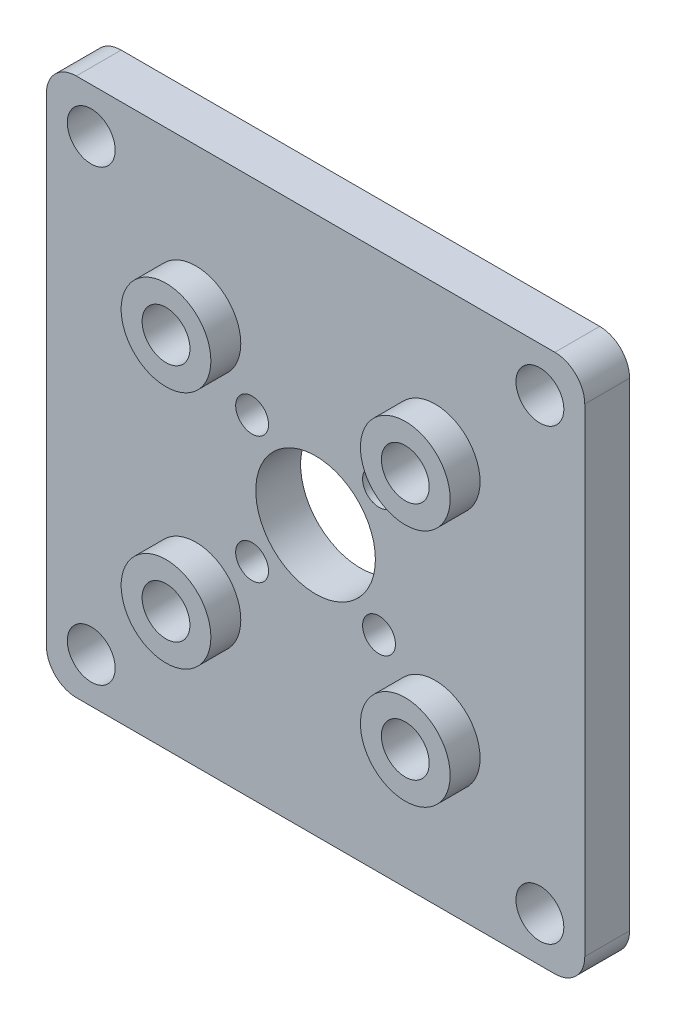
ISO-10303-21;
HEADER;
FILE_DESCRIPTION(('STEP AP214'),'2;1');
FILE_NAME('part.step','',(''),(''),'','','');
FILE_SCHEMA(('AUTOMOTIVE_DESIGN { 1 0 10303 214 1 1 1 1 }'));
ENDSEC;
DATA;
#1=APPLICATION_CONTEXT('core data for automotive mechanical design processes');
#2=APPLICATION_PROTOCOL_DEFINITION('international standard','automotive_design',2000,#1);
#3=PRODUCT_CONTEXT('',#1,'mechanical');
#4=PRODUCT('Part','Part','',(#3));
#5=PRODUCT_RELATED_PRODUCT_CATEGORY('part','',(#4));
#6=PRODUCT_DEFINITION_FORMATION('','',#4);
#7=PRODUCT_DEFINITION_CONTEXT('part definition',#1,'design');
#8=PRODUCT_DEFINITION('design','',#6,#7);
#9=PRODUCT_DEFINITION_SHAPE('','',#8);
#10=(LENGTH_UNIT() NAMED_UNIT(*) SI_UNIT(.MILLI.,.METRE.));
#11=(NAMED_UNIT(*) PLANE_ANGLE_UNIT() SI_UNIT($,.RADIAN.));
#12=(NAMED_UNIT(*) SI_UNIT($,.STERADIAN.) SOLID_ANGLE_UNIT());
#13=UNCERTAINTY_MEASURE_WITH_UNIT(LENGTH_MEASURE(1.E-05),#10,'distance_accuracy_value','');
#14=(GEOMETRIC_REPRESENTATION_CONTEXT(3) GLOBAL_UNCERTAINTY_ASSIGNED_CONTEXT((#13)) GLOBAL_UNIT_ASSIGNED_CONTEXT((#10,
#11,#12)) REPRESENTATION_CONTEXT('',''));
#15=CARTESIAN_POINT('',(0.,0.,0.));
#16=DIRECTION('',(0.,0.,1.));
#17=DIRECTION('',(1.,0.,0.));
#18=AXIS2_PLACEMENT_3D('',#15,#16,#17);
#19=CARTESIAN_POINT('',(0.,0.,3.));
#20=DIRECTION('',(0.,0.,1.));
#21=DIRECTION('',(1.,0.,0.));
#22=AXIS2_PLACEMENT_3D('',#19,#20,#21);
#23=PLANE('',#22);
#24=CARTESIAN_POINT('',(-8.,-8.,3.));
#25=DIRECTION('',(0.,0.,1.));
#26=DIRECTION('',(1.,0.,0.));
#27=AXIS2_PLACEMENT_3D('',#24,#25,#26);
#28=CIRCLE('',#27,3.);
#29=CARTESIAN_POINT('',(-5.,-8.,3.));
#30=VERTEX_POINT('',#29);
#31=EDGE_CURVE('E250',#30,#30,#28,.T.);
#32=ORIENTED_EDGE('',*,*,#31,.F.);
#33=EDGE_LOOP('',(#32));
#34=FACE_BOUND('',#33,.T.);
#35=CARTESIAN_POINT('',(8.,-8.,3.));
#36=DIRECTION('',(0.,0.,1.));
#37=DIRECTION('',(1.,0.,0.));
#38=AXIS2_PLACEMENT_3D('',#35,#36,#37);
#39=CIRCLE('',#38,3.);
#40=CARTESIAN_POINT('',(11.,-8.,3.));
#41=VERTEX_POINT('',#40);
#42=EDGE_CURVE('E244',#41,#41,#39,.T.);
#43=ORIENTED_EDGE('',*,*,#42,.F.);
#44=EDGE_LOOP('',(#43));
#45=FACE_BOUND('',#44,.T.);
#46=CARTESIAN_POINT('',(8.,8.,3.));
#47=DIRECTION('',(0.,0.,1.));
#48=DIRECTION('',(1.,0.,0.));
#49=AXIS2_PLACEMENT_3D('',#46,#47,#48);
#50=CIRCLE('',#49,3.);
#51=CARTESIAN_POINT('',(11.,8.,3.));
#52=VERTEX_POINT('',#51);
#53=EDGE_CURVE('E238',#52,#52,#50,.T.);
#54=ORIENTED_EDGE('',*,*,#53,.F.);
#55=EDGE_LOOP('',(#54));
#56=FACE_BOUND('',#55,.T.);
#57=CARTESIAN_POINT('',(-8.,8.,3.));
#58=DIRECTION('',(0.,0.,1.));
#59=DIRECTION('',(1.,0.,0.));
#60=AXIS2_PLACEMENT_3D('',#57,#58,#59);
#61=CIRCLE('',#60,3.);
#62=CARTESIAN_POINT('',(-5.,8.,3.));
#63=VERTEX_POINT('',#62);
#64=EDGE_CURVE('E232',#63,#63,#61,.T.);
#65=ORIENTED_EDGE('',*,*,#64,.F.);
#66=EDGE_LOOP('',(#65));
#67=FACE_BOUND('',#66,.T.);
#68=CARTESIAN_POINT('',(15.,-15.,3.));
#69=DIRECTION('',(0.,0.,1.));
#70=DIRECTION('',(1.,0.,0.));
#71=AXIS2_PLACEMENT_3D('',#68,#69,#70);
#72=CIRCLE('',#71,1.6);
#73=CARTESIAN_POINT('',(16.6,-15.,3.));
#74=VERTEX_POINT('',#73);
#75=EDGE_CURVE('E217',#74,#74,#72,.T.);
#76=ORIENTED_EDGE('',*,*,#75,.F.);
#77=EDGE_LOOP('',(#76));
#78=FACE_BOUND('',#77,.T.);
#79=CARTESIAN_POINT('',(-15.,15.,3.));
#80=DIRECTION('',(0.,0.,1.));
#81=DIRECTION('',(1.,0.,0.));
#82=AXIS2_PLACEMENT_3D('',#79,#80,#81);
#83=CIRCLE('',#82,1.6);
#84=CARTESIAN_POINT('',(-13.4,15.,3.));
#85=VERTEX_POINT('',#84);
#86=EDGE_CURVE('E205',#85,#85,#83,.T.);
#87=ORIENTED_EDGE('',*,*,#86,.F.);
#88=EDGE_LOOP('',(#87));
#89=FACE_BOUND('',#88,.T.);
#90=CARTESIAN_POINT('',(4.2426406871195,-4.24264068711907,3.));
#91=DIRECTION('',(0.,0.,1.));
#92=DIRECTION('',(1.,0.,0.));
#93=AXIS2_PLACEMENT_3D('',#90,#91,#92);
#94=CIRCLE('',#93,1.1);
#95=CARTESIAN_POINT('',(5.3426406871195,-4.24264068711907,3.));
#96=VERTEX_POINT('',#95);
#97=EDGE_CURVE('E193',#96,#96,#94,.T.);
#98=ORIENTED_EDGE('',*,*,#97,.F.);
#99=EDGE_LOOP('',(#98));
#100=FACE_BOUND('',#99,.T.);
#101=CARTESIAN_POINT('',(0.,0.,3.));
#102=DIRECTION('',(0.,0.,1.));
#103=DIRECTION('',(1.,0.,0.));
#104=AXIS2_PLACEMENT_3D('',#101,#102,#103);
#105=CIRCLE('',#104,4.);
#106=CARTESIAN_POINT('',(4.,0.,3.));
#107=VERTEX_POINT('',#106);
#108=EDGE_CURVE('E182',#107,#107,#105,.T.);
#109=ORIENTED_EDGE('',*,*,#108,.F.);
#110=EDGE_LOOP('',(#109));
#111=FACE_BOUND('',#110,.T.);
#112=DIRECTION('',(-1.,0.,0.));
#113=VECTOR('',#112,1.);
#114=CARTESIAN_POINT('',(18.,18.,3.));
#115=LINE('',#114,#113);
#116=CARTESIAN_POINT('',(16.,18.,3.));
#117=VERTEX_POINT('',#116);
#118=CARTESIAN_POINT('',(-16.,18.,3.));
#119=VERTEX_POINT('',#118);
#120=EDGE_CURVE('E137',#117,#119,#115,.T.);
#121=ORIENTED_EDGE('',*,*,#120,.T.);
#122=CARTESIAN_POINT('',(-16.,16.,3.));
#123=DIRECTION('',(0.,0.,1.));
#124=DIRECTION('',(1.,0.,0.));
#125=AXIS2_PLACEMENT_3D('',#122,#123,#124);
#126=CIRCLE('',#125,2.);
#127=CARTESIAN_POINT('',(-18.,16.,3.));
#128=VERTEX_POINT('',#127);
#129=EDGE_CURVE('E156',#119,#128,#126,.T.);
#130=ORIENTED_EDGE('',*,*,#129,.T.);
#131=DIRECTION('',(0.,-1.,0.));
#132=VECTOR('',#131,1.);
#133=CARTESIAN_POINT('',(-18.,-18.,3.));
#134=LINE('',#133,#132);
#135=CARTESIAN_POINT('',(-18.,-16.,3.));
#136=VERTEX_POINT('',#135);
#137=EDGE_CURVE('E120',#128,#136,#134,.T.);
#138=ORIENTED_EDGE('',*,*,#137,.T.);
#139=CARTESIAN_POINT('',(-16.,-16.,3.));
#140=DIRECTION('',(0.,0.,1.));
#141=DIRECTION('',(1.,0.,0.));
#142=AXIS2_PLACEMENT_3D('',#139,#140,#141);
#143=CIRCLE('',#142,2.);
#144=CARTESIAN_POINT('',(-16.,-18.,3.));
#145=VERTEX_POINT('',#144);
#146=EDGE_CURVE('E154',#136,#145,#143,.T.);
#147=ORIENTED_EDGE('',*,*,#146,.T.);
#148=DIRECTION('',(1.,0.,0.));
#149=VECTOR('',#148,1.);
#150=CARTESIAN_POINT('',(18.,-18.,3.));
#151=LINE('',#150,#149);
#152=CARTESIAN_POINT('',(16.,-18.,3.));
#153=VERTEX_POINT('',#152);
#154=EDGE_CURVE('E167',#145,#153,#151,.T.);
#155=ORIENTED_EDGE('',*,*,#154,.T.);
#156=CARTESIAN_POINT('',(16.,-16.,3.));
#157=DIRECTION('',(0.,0.,1.));
#158=DIRECTION('',(1.,0.,0.));
#159=AXIS2_PLACEMENT_3D('',#156,#157,#158);
#160=CIRCLE('',#159,2.);
#161=CARTESIAN_POINT('',(18.,-16.,3.));
#162=VERTEX_POINT('',#161);
#163=EDGE_CURVE('E55',#153,#162,#160,.T.);
#164=ORIENTED_EDGE('',*,*,#163,.T.);
#165=DIRECTION('',(0.,1.,0.));
#166=VECTOR('',#165,1.);
#167=CARTESIAN_POINT('',(18.,-18.,3.));
#168=LINE('',#167,#166);
#169=CARTESIAN_POINT('',(18.,16.,3.));
#170=VERTEX_POINT('',#169);
#171=EDGE_CURVE('E175',#162,#170,#168,.T.);
#172=ORIENTED_EDGE('',*,*,#171,.T.);
#173=CARTESIAN_POINT('',(16.,16.,3.));
#174=DIRECTION('',(0.,0.,1.));
#175=DIRECTION('',(1.,0.,0.));
#176=AXIS2_PLACEMENT_3D('',#173,#174,#175);
#177=CIRCLE('',#176,2.);
#178=EDGE_CURVE('E151',#170,#117,#177,.T.);
#179=ORIENTED_EDGE('',*,*,#178,.T.);
#180=EDGE_LOOP('',(#121,#130,#138,#147,#155,#164,#172,#179));
#181=FACE_BOUND('',#180,.T.);
#182=CARTESIAN_POINT('',(-4.24264068711926,4.24264068711931,3.));
#183=DIRECTION('',(0.,0.,1.));
#184=DIRECTION('',(1.,0.,0.));
#185=AXIS2_PLACEMENT_3D('',#182,#183,#184);
#186=CIRCLE('',#185,1.1);
#187=CARTESIAN_POINT('',(-3.14264068711926,4.24264068711931,3.));
#188=VERTEX_POINT('',#187);
#189=EDGE_CURVE('E128',#188,#188,#186,.T.);
#190=ORIENTED_EDGE('',*,*,#189,.F.);
#191=EDGE_LOOP('',(#190));
#192=FACE_BOUND('',#191,.T.);
#193=CARTESIAN_POINT('',(4.24264068711931,4.2426406871195,3.));
#194=DIRECTION('',(0.,0.,1.));
#195=DIRECTION('',(1.,0.,0.));
#196=AXIS2_PLACEMENT_3D('',#193,#194,#195);
#197=CIRCLE('',#196,1.1);
#198=CARTESIAN_POINT('',(5.34264068711931,4.2426406871195,3.));
#199=VERTEX_POINT('',#198);
#200=EDGE_CURVE('E187',#199,#199,#197,.T.);
#201=ORIENTED_EDGE('',*,*,#200,.F.);
#202=EDGE_LOOP('',(#201));
#203=FACE_BOUND('',#202,.T.);
#204=CARTESIAN_POINT('',(-4.24264068711907,-4.24264068711926,3.));
#205=DIRECTION('',(0.,0.,1.));
#206=DIRECTION('',(1.,0.,0.));
#207=AXIS2_PLACEMENT_3D('',#204,#205,#206);
#208=CIRCLE('',#207,1.1);
#209=CARTESIAN_POINT('',(-3.14264068711907,-4.24264068711926,3.));
#210=VERTEX_POINT('',#209);
#211=EDGE_CURVE('E199',#210,#210,#208,.T.);
#212=ORIENTED_EDGE('',*,*,#211,.F.);
#213=EDGE_LOOP('',(#212));
#214=FACE_BOUND('',#213,.T.);
#215=CARTESIAN_POINT('',(15.,15.,3.));
#216=DIRECTION('',(0.,0.,1.));
#217=DIRECTION('',(-1.,0.,0.));
#218=AXIS2_PLACEMENT_3D('',#215,#216,#217);
#219=CIRCLE('',#218,1.6);
#220=CARTESIAN_POINT('',(13.4,15.,3.));
#221=VERTEX_POINT('',#220);
#222=EDGE_CURVE('E211',#221,#221,#219,.T.);
#223=ORIENTED_EDGE('',*,*,#222,.F.);
#224=EDGE_LOOP('',(#223));
#225=FACE_BOUND('',#224,.T.);
#226=CARTESIAN_POINT('',(-15.,-15.,3.));
#227=DIRECTION('',(0.,0.,1.));
#228=DIRECTION('',(-1.,0.,0.));
#229=AXIS2_PLACEMENT_3D('',#226,#227,#228);
#230=CIRCLE('',#229,1.6);
#231=CARTESIAN_POINT('',(-16.6,-15.,3.));
#232=VERTEX_POINT('',#231);
#233=EDGE_CURVE('E223',#232,#232,#230,.T.);
#234=ORIENTED_EDGE('',*,*,#233,.F.);
#235=EDGE_LOOP('',(#234));
#236=FACE_BOUND('',#235,.T.);
#237=ADVANCED_FACE('F34',(#34,#45,#56,#67,#78,#89,#100,#111,#181,#192,#203,#214,#225,#236),#23,.T.);
#238=CARTESIAN_POINT('',(0.,0.,0.));
#239=DIRECTION('',(0.,0.,1.));
#240=DIRECTION('',(1.,0.,0.));
#241=AXIS2_PLACEMENT_3D('',#238,#239,#240);
#242=PLANE('',#241);
#243=CARTESIAN_POINT('',(8.,8.,0.));
#244=DIRECTION('',(0.,0.,1.));
#245=DIRECTION('',(-1.,0.,0.));
#246=AXIS2_PLACEMENT_3D('',#243,#244,#245);
#247=CIRCLE('',#246,1.6);
#248=CARTESIAN_POINT('',(6.4,8.,0.));
#249=VERTEX_POINT('',#248);
#250=EDGE_CURVE('E259',#249,#249,#247,.T.);
#251=ORIENTED_EDGE('',*,*,#250,.T.);
#252=EDGE_LOOP('',(#251));
#253=FACE_BOUND('',#252,.T.);
#254=CARTESIAN_POINT('',(8.,-8.,0.));
#255=DIRECTION('',(0.,0.,1.));
#256=DIRECTION('',(1.,0.,0.));
#257=AXIS2_PLACEMENT_3D('',#254,#255,#256);
#258=CIRCLE('',#257,1.6);
#259=CARTESIAN_POINT('',(9.6,-8.,0.));
#260=VERTEX_POINT('',#259);
#261=EDGE_CURVE('E271',#260,#260,#258,.T.);
#262=ORIENTED_EDGE('',*,*,#261,.T.);
#263=EDGE_LOOP('',(#262));
#264=FACE_BOUND('',#263,.T.);
#265=CARTESIAN_POINT('',(-8.,-8.,0.));
#266=DIRECTION('',(0.,0.,1.));
#267=DIRECTION('',(-1.,0.,0.));
#268=AXIS2_PLACEMENT_3D('',#265,#266,#267);
#269=CIRCLE('',#268,1.6);
#270=CARTESIAN_POINT('',(-9.6,-8.,0.));
#271=VERTEX_POINT('',#270);
#272=EDGE_CURVE('E265',#271,#271,#269,.T.);
#273=ORIENTED_EDGE('',*,*,#272,.T.);
#274=EDGE_LOOP('',(#273));
#275=FACE_BOUND('',#274,.T.);
#276=CARTESIAN_POINT('',(-8.,8.,0.));
#277=DIRECTION('',(0.,0.,1.));
#278=DIRECTION('',(1.,0.,0.));
#279=AXIS2_PLACEMENT_3D('',#276,#277,#278);
#280=CIRCLE('',#279,1.6);
#281=CARTESIAN_POINT('',(-6.4,8.,0.));
#282=VERTEX_POINT('',#281);
#283=EDGE_CURVE('E253',#282,#282,#280,.T.);
#284=ORIENTED_EDGE('',*,*,#283,.T.);
#285=EDGE_LOOP('',(#284));
#286=FACE_BOUND('',#285,.T.);
#287=DIRECTION('',(0.,-1.,0.));
#288=VECTOR('',#287,1.);
#289=CARTESIAN_POINT('',(-18.,-18.,0.));
#290=LINE('',#289,#288);
#291=CARTESIAN_POINT('',(-18.,16.,0.));
#292=VERTEX_POINT('',#291);
#293=CARTESIAN_POINT('',(-18.,-16.,0.));
#294=VERTEX_POINT('',#293);
#295=EDGE_CURVE('E117',#292,#294,#290,.T.);
#296=ORIENTED_EDGE('',*,*,#295,.F.);
#297=CARTESIAN_POINT('',(-16.,16.,0.));
#298=DIRECTION('',(0.,0.,1.));
#299=DIRECTION('',(1.,0.,0.));
#300=AXIS2_PLACEMENT_3D('',#297,#298,#299);
#301=CIRCLE('',#300,2.);
#302=CARTESIAN_POINT('',(-16.,18.,0.));
#303=VERTEX_POINT('',#302);
#304=EDGE_CURVE('E100',#292,#303,#301,.F.);
#305=ORIENTED_EDGE('',*,*,#304,.T.);
#306=DIRECTION('',(-1.,0.,0.));
#307=VECTOR('',#306,1.);
#308=CARTESIAN_POINT('',(18.,18.,0.));
#309=LINE('',#308,#307);
#310=CARTESIAN_POINT('',(16.,18.,0.));
#311=VERTEX_POINT('',#310);
#312=EDGE_CURVE('E141',#311,#303,#309,.T.);
#313=ORIENTED_EDGE('',*,*,#312,.F.);
#314=CARTESIAN_POINT('',(16.,16.,0.));
#315=DIRECTION('',(0.,0.,1.));
#316=DIRECTION('',(1.,0.,0.));
#317=AXIS2_PLACEMENT_3D('',#314,#315,#316);
#318=CIRCLE('',#317,2.);
#319=CARTESIAN_POINT('',(18.,16.,0.));
#320=VERTEX_POINT('',#319);
#321=EDGE_CURVE('E121',#311,#320,#318,.F.);
#322=ORIENTED_EDGE('',*,*,#321,.T.);
#323=DIRECTION('',(0.,1.,0.));
#324=VECTOR('',#323,1.);
#325=CARTESIAN_POINT('',(18.,-18.,0.));
#326=LINE('',#325,#324);
#327=CARTESIAN_POINT('',(18.,-16.,0.));
#328=VERTEX_POINT('',#327);
#329=EDGE_CURVE('E131',#328,#320,#326,.T.);
#330=ORIENTED_EDGE('',*,*,#329,.F.);
#331=CARTESIAN_POINT('',(16.,-16.,0.));
#332=DIRECTION('',(0.,0.,1.));
#333=DIRECTION('',(1.,0.,0.));
#334=AXIS2_PLACEMENT_3D('',#331,#332,#333);
#335=CIRCLE('',#334,2.);
#336=CARTESIAN_POINT('',(16.,-18.,0.));
#337=VERTEX_POINT('',#336);
#338=EDGE_CURVE('E145',#328,#337,#335,.F.);
#339=ORIENTED_EDGE('',*,*,#338,.T.);
#340=DIRECTION('',(1.,0.,0.));
#341=VECTOR('',#340,1.);
#342=CARTESIAN_POINT('',(18.,-18.,0.));
#343=LINE('',#342,#341);
#344=CARTESIAN_POINT('',(-16.,-18.,0.));
#345=VERTEX_POINT('',#344);
#346=EDGE_CURVE('E127',#345,#337,#343,.T.);
#347=ORIENTED_EDGE('',*,*,#346,.F.);
#348=CARTESIAN_POINT('',(-16.,-16.,0.));
#349=DIRECTION('',(0.,0.,1.));
#350=DIRECTION('',(1.,0.,0.));
#351=AXIS2_PLACEMENT_3D('',#348,#349,#350);
#352=CIRCLE('',#351,2.);
#353=EDGE_CURVE('E111',#345,#294,#352,.F.);
#354=ORIENTED_EDGE('',*,*,#353,.T.);
#355=EDGE_LOOP('',(#296,#305,#313,#322,#330,#339,#347,#354));
#356=FACE_BOUND('',#355,.T.);
#357=CARTESIAN_POINT('',(-4.24264068711926,4.24264068711931,0.));
#358=DIRECTION('',(0.,0.,1.));
#359=DIRECTION('',(1.,0.,0.));
#360=AXIS2_PLACEMENT_3D('',#357,#358,#359);
#361=CIRCLE('',#360,1.1);
#362=CARTESIAN_POINT('',(-3.14264068711926,4.24264068711931,0.));
#363=VERTEX_POINT('',#362);
#364=EDGE_CURVE('E134',#363,#363,#361,.T.);
#365=ORIENTED_EDGE('',*,*,#364,.T.);
#366=EDGE_LOOP('',(#365));
#367=FACE_BOUND('',#366,.T.);
#368=CARTESIAN_POINT('',(0.,0.,0.));
#369=DIRECTION('',(0.,0.,1.));
#370=DIRECTION('',(1.,0.,0.));
#371=AXIS2_PLACEMENT_3D('',#368,#369,#370);
#372=CIRCLE('',#371,4.);
#373=CARTESIAN_POINT('',(4.,0.,0.));
#374=VERTEX_POINT('',#373);
#375=EDGE_CURVE('E184',#374,#374,#372,.T.);
#376=ORIENTED_EDGE('',*,*,#375,.T.);
#377=EDGE_LOOP('',(#376));
#378=FACE_BOUND('',#377,.T.);
#379=CARTESIAN_POINT('',(4.24264068711931,4.2426406871195,0.));
#380=DIRECTION('',(0.,0.,1.));
#381=DIRECTION('',(1.,0.,0.));
#382=AXIS2_PLACEMENT_3D('',#379,#380,#381);
#383=CIRCLE('',#382,1.1);
#384=CARTESIAN_POINT('',(5.34264068711931,4.2426406871195,0.));
#385=VERTEX_POINT('',#384);
#386=EDGE_CURVE('E190',#385,#385,#383,.T.);
#387=ORIENTED_EDGE('',*,*,#386,.T.);
#388=EDGE_LOOP('',(#387));
#389=FACE_BOUND('',#388,.T.);
#390=CARTESIAN_POINT('',(4.2426406871195,-4.24264068711907,0.));
#391=DIRECTION('',(0.,0.,1.));
#392=DIRECTION('',(1.,0.,0.));
#393=AXIS2_PLACEMENT_3D('',#390,#391,#392);
#394=CIRCLE('',#393,1.1);
#395=CARTESIAN_POINT('',(5.3426406871195,-4.24264068711907,0.));
#396=VERTEX_POINT('',#395);
#397=EDGE_CURVE('E196',#396,#396,#394,.T.);
#398=ORIENTED_EDGE('',*,*,#397,.T.);
#399=EDGE_LOOP('',(#398));
#400=FACE_BOUND('',#399,.T.);
#401=CARTESIAN_POINT('',(-4.24264068711907,-4.24264068711926,0.));
#402=DIRECTION('',(0.,0.,1.));
#403=DIRECTION('',(1.,0.,0.));
#404=AXIS2_PLACEMENT_3D('',#401,#402,#403);
#405=CIRCLE('',#404,1.1);
#406=CARTESIAN_POINT('',(-3.14264068711907,-4.24264068711926,0.));
#407=VERTEX_POINT('',#406);
#408=EDGE_CURVE('E202',#407,#407,#405,.T.);
#409=ORIENTED_EDGE('',*,*,#408,.T.);
#410=EDGE_LOOP('',(#409));
#411=FACE_BOUND('',#410,.T.);
#412=CARTESIAN_POINT('',(-15.,15.,0.));
#413=DIRECTION('',(0.,0.,1.));
#414=DIRECTION('',(1.,0.,0.));
#415=AXIS2_PLACEMENT_3D('',#412,#413,#414);
#416=CIRCLE('',#415,1.6);
#417=CARTESIAN_POINT('',(-13.4,15.,0.));
#418=VERTEX_POINT('',#417);
#419=EDGE_CURVE('E208',#418,#418,#416,.T.);
#420=ORIENTED_EDGE('',*,*,#419,.T.);
#421=EDGE_LOOP('',(#420));
#422=FACE_BOUND('',#421,.T.);
#423=CARTESIAN_POINT('',(15.,15.,0.));
#424=DIRECTION('',(0.,0.,1.));
#425=DIRECTION('',(-1.,0.,0.));
#426=AXIS2_PLACEMENT_3D('',#423,#424,#425);
#427=CIRCLE('',#426,1.6);
#428=CARTESIAN_POINT('',(13.4,15.,0.));
#429=VERTEX_POINT('',#428);
#430=EDGE_CURVE('E214',#429,#429,#427,.T.);
#431=ORIENTED_EDGE('',*,*,#430,.T.);
#432=EDGE_LOOP('',(#431));
#433=FACE_BOUND('',#432,.T.);
#434=CARTESIAN_POINT('',(15.,-15.,0.));
#435=DIRECTION('',(0.,0.,1.));
#436=DIRECTION('',(1.,0.,0.));
#437=AXIS2_PLACEMENT_3D('',#434,#435,#436);
#438=CIRCLE('',#437,1.6);
#439=CARTESIAN_POINT('',(16.6,-15.,0.));
#440=VERTEX_POINT('',#439);
#441=EDGE_CURVE('E220',#440,#440,#438,.T.);
#442=ORIENTED_EDGE('',*,*,#441,.T.);
#443=EDGE_LOOP('',(#442));
#444=FACE_BOUND('',#443,.T.);
#445=CARTESIAN_POINT('',(-15.,-15.,0.));
#446=DIRECTION('',(0.,0.,1.));
#447=DIRECTION('',(-1.,0.,0.));
#448=AXIS2_PLACEMENT_3D('',#445,#446,#447);
#449=CIRCLE('',#448,1.6);
#450=CARTESIAN_POINT('',(-16.6,-15.,0.));
#451=VERTEX_POINT('',#450);
#452=EDGE_CURVE('E226',#451,#451,#449,.T.);
#453=ORIENTED_EDGE('',*,*,#452,.T.);
#454=EDGE_LOOP('',(#453));
#455=FACE_BOUND('',#454,.T.);
#456=ADVANCED_FACE('F124',(#253,#264,#275,#286,#356,#367,#378,#389,#400,#411,#422,#433,#444,
#455),#242,.F.);
#457=CARTESIAN_POINT('',(-18.,-18.,3.));
#458=DIRECTION('',(1.,0.,0.));
#459=DIRECTION('',(0.,0.,-1.));
#460=AXIS2_PLACEMENT_3D('',#457,#458,#459);
#461=PLANE('',#460);
#462=ORIENTED_EDGE('',*,*,#137,.F.);
#463=DIRECTION('',(0.,0.,-1.));
#464=VECTOR('',#463,1.);
#465=CARTESIAN_POINT('',(-18.,16.,3.));
#466=LINE('',#465,#464);
#467=EDGE_CURVE('E104',#128,#292,#466,.T.);
#468=ORIENTED_EDGE('',*,*,#467,.T.);
#469=ORIENTED_EDGE('',*,*,#295,.T.);
#470=DIRECTION('',(0.,0.,-1.));
#471=VECTOR('',#470,1.);
#472=CARTESIAN_POINT('',(-18.,-16.,3.));
#473=LINE('',#472,#471);
#474=EDGE_CURVE('E122',#294,#136,#473,.F.);
#475=ORIENTED_EDGE('',*,*,#474,.T.);
#476=EDGE_LOOP('',(#462,#468,#469,#475));
#477=FACE_BOUND('',#476,.T.);
#478=ADVANCED_FACE('F116',(#477),#461,.F.);
#479=CARTESIAN_POINT('',(18.,-18.,3.));
#480=DIRECTION('',(0.,1.,0.));
#481=DIRECTION('',(-1.,0.,0.));
#482=AXIS2_PLACEMENT_3D('',#479,#480,#481);
#483=PLANE('',#482);
#484=ORIENTED_EDGE('',*,*,#154,.F.);
#485=DIRECTION('',(0.,0.,-1.));
#486=VECTOR('',#485,1.);
#487=CARTESIAN_POINT('',(-16.,-18.,3.));
#488=LINE('',#487,#486);
#489=EDGE_CURVE('E160',#145,#345,#488,.T.);
#490=ORIENTED_EDGE('',*,*,#489,.T.);
#491=ORIENTED_EDGE('',*,*,#346,.T.);
#492=DIRECTION('',(0.,0.,-1.));
#493=VECTOR('',#492,1.);
#494=CARTESIAN_POINT('',(16.,-18.,3.));
#495=LINE('',#494,#493);
#496=EDGE_CURVE('E158',#337,#153,#495,.F.);
#497=ORIENTED_EDGE('',*,*,#496,.T.);
#498=EDGE_LOOP('',(#484,#490,#491,#497));
#499=FACE_BOUND('',#498,.T.);
#500=ADVANCED_FACE('F165',(#499),#483,.F.);
#501=CARTESIAN_POINT('',(18.,-18.,3.));
#502=DIRECTION('',(-1.,0.,0.));
#503=DIRECTION('',(0.,0.,1.));
#504=AXIS2_PLACEMENT_3D('',#501,#502,#503);
#505=PLANE('',#504);
#506=ORIENTED_EDGE('',*,*,#171,.F.);
#507=DIRECTION('',(0.,0.,-1.));
#508=VECTOR('',#507,1.);
#509=CARTESIAN_POINT('',(18.,-16.,3.));
#510=LINE('',#509,#508);
#511=EDGE_CURVE('E11',#162,#328,#510,.T.);
#512=ORIENTED_EDGE('',*,*,#511,.T.);
#513=ORIENTED_EDGE('',*,*,#329,.T.);
#514=DIRECTION('',(0.,0.,-1.));
#515=VECTOR('',#514,1.);
#516=CARTESIAN_POINT('',(18.,16.,3.));
#517=LINE('',#516,#515);
#518=EDGE_CURVE('E42',#320,#170,#517,.F.);
#519=ORIENTED_EDGE('',*,*,#518,.T.);
#520=EDGE_LOOP('',(#506,#512,#513,#519));
#521=FACE_BOUND('',#520,.T.);
#522=ADVANCED_FACE('F174',(#521),#505,.F.);
#523=CARTESIAN_POINT('',(18.,18.,3.));
#524=DIRECTION('',(0.,-1.,0.));
#525=DIRECTION('',(1.,0.,0.));
#526=AXIS2_PLACEMENT_3D('',#523,#524,#525);
#527=PLANE('',#526);
#528=ORIENTED_EDGE('',*,*,#312,.T.);
#529=DIRECTION('',(0.,0.,-1.));
#530=VECTOR('',#529,1.);
#531=CARTESIAN_POINT('',(-16.,18.,3.));
#532=LINE('',#531,#530);
#533=EDGE_CURVE('E105',#303,#119,#532,.F.);
#534=ORIENTED_EDGE('',*,*,#533,.T.);
#535=ORIENTED_EDGE('',*,*,#120,.F.);
#536=DIRECTION('',(0.,0.,-1.));
#537=VECTOR('',#536,1.);
#538=CARTESIAN_POINT('',(16.,18.,3.));
#539=LINE('',#538,#537);
#540=EDGE_CURVE('E110',#117,#311,#539,.T.);
#541=ORIENTED_EDGE('',*,*,#540,.T.);
#542=EDGE_LOOP('',(#528,#534,#535,#541));
#543=FACE_BOUND('',#542,.T.);
#544=ADVANCED_FACE('F344',(#543),#527,.F.);
#545=CARTESIAN_POINT('',(-4.24264068711926,4.24264068711931,3.));
#546=DIRECTION('',(0.,0.,-1.));
#547=DIRECTION('',(-1.,0.,0.));
#548=AXIS2_PLACEMENT_3D('',#545,#546,#547);
#549=CYLINDRICAL_SURFACE('',#548,1.1);
#550=ORIENTED_EDGE('',*,*,#189,.T.);
#551=EDGE_LOOP('',(#550));
#552=FACE_BOUND('',#551,.T.);
#553=ORIENTED_EDGE('',*,*,#364,.F.);
#554=EDGE_LOOP('',(#553));
#555=FACE_BOUND('',#554,.T.);
#556=ADVANCED_FACE('F347',(#552,#555),#549,.F.);
#557=CARTESIAN_POINT('',(0.,0.,3.));
#558=DIRECTION('',(0.,0.,-1.));
#559=DIRECTION('',(-1.,0.,0.));
#560=AXIS2_PLACEMENT_3D('',#557,#558,#559);
#561=CYLINDRICAL_SURFACE('',#560,4.);
#562=ORIENTED_EDGE('',*,*,#108,.T.);
#563=EDGE_LOOP('',(#562));
#564=FACE_BOUND('',#563,.T.);
#565=ORIENTED_EDGE('',*,*,#375,.F.);
#566=EDGE_LOOP('',(#565));
#567=FACE_BOUND('',#566,.T.);
#568=ADVANCED_FACE('F586',(#564,#567),#561,.F.);
#569=CARTESIAN_POINT('',(4.24264068711931,4.2426406871195,3.));
#570=DIRECTION('',(0.,0.,-1.));
#571=DIRECTION('',(-1.,0.,0.));
#572=AXIS2_PLACEMENT_3D('',#569,#570,#571);
#573=CYLINDRICAL_SURFACE('',#572,1.1);
#574=ORIENTED_EDGE('',*,*,#200,.T.);
#575=EDGE_LOOP('',(#574));
#576=FACE_BOUND('',#575,.T.);
#577=ORIENTED_EDGE('',*,*,#386,.F.);
#578=EDGE_LOOP('',(#577));
#579=FACE_BOUND('',#578,.T.);
#580=ADVANCED_FACE('F576',(#576,#579),#573,.F.);
#581=CARTESIAN_POINT('',(4.2426406871195,-4.24264068711907,3.));
#582=DIRECTION('',(0.,0.,-1.));
#583=DIRECTION('',(-1.,0.,0.));
#584=AXIS2_PLACEMENT_3D('',#581,#582,#583);
#585=CYLINDRICAL_SURFACE('',#584,1.1);
#586=ORIENTED_EDGE('',*,*,#97,.T.);
#587=EDGE_LOOP('',(#586));
#588=FACE_BOUND('',#587,.T.);
#589=ORIENTED_EDGE('',*,*,#397,.F.);
#590=EDGE_LOOP('',(#589));
#591=FACE_BOUND('',#590,.T.);
#592=ADVANCED_FACE('F566',(#588,#591),#585,.F.);
#593=CARTESIAN_POINT('',(-4.24264068711907,-4.24264068711926,3.));
#594=DIRECTION('',(0.,0.,-1.));
#595=DIRECTION('',(-1.,0.,0.));
#596=AXIS2_PLACEMENT_3D('',#593,#594,#595);
#597=CYLINDRICAL_SURFACE('',#596,1.1);
#598=ORIENTED_EDGE('',*,*,#211,.T.);
#599=EDGE_LOOP('',(#598));
#600=FACE_BOUND('',#599,.T.);
#601=ORIENTED_EDGE('',*,*,#408,.F.);
#602=EDGE_LOOP('',(#601));
#603=FACE_BOUND('',#602,.T.);
#604=ADVANCED_FACE('F556',(#600,#603),#597,.F.);
#605=CARTESIAN_POINT('',(-15.,15.,3.));
#606=DIRECTION('',(0.,0.,-1.));
#607=DIRECTION('',(-1.,0.,0.));
#608=AXIS2_PLACEMENT_3D('',#605,#606,#607);
#609=CYLINDRICAL_SURFACE('',#608,1.6);
#610=ORIENTED_EDGE('',*,*,#86,.T.);
#611=EDGE_LOOP('',(#610));
#612=FACE_BOUND('',#611,.T.);
#613=ORIENTED_EDGE('',*,*,#419,.F.);
#614=EDGE_LOOP('',(#613));
#615=FACE_BOUND('',#614,.T.);
#616=ADVANCED_FACE('F546',(#612,#615),#609,.F.);
#617=CARTESIAN_POINT('',(15.,15.,3.));
#618=DIRECTION('',(0.,0.,-1.));
#619=DIRECTION('',(-1.,0.,0.));
#620=AXIS2_PLACEMENT_3D('',#617,#618,#619);
#621=CYLINDRICAL_SURFACE('',#620,1.6);
#622=ORIENTED_EDGE('',*,*,#222,.T.);
#623=EDGE_LOOP('',(#622));
#624=FACE_BOUND('',#623,.T.);
#625=ORIENTED_EDGE('',*,*,#430,.F.);
#626=EDGE_LOOP('',(#625));
#627=FACE_BOUND('',#626,.T.);
#628=ADVANCED_FACE('F536',(#624,#627),#621,.F.);
#629=CARTESIAN_POINT('',(15.,-15.,3.));
#630=DIRECTION('',(0.,0.,-1.));
#631=DIRECTION('',(-1.,0.,0.));
#632=AXIS2_PLACEMENT_3D('',#629,#630,#631);
#633=CYLINDRICAL_SURFACE('',#632,1.6);
#634=ORIENTED_EDGE('',*,*,#75,.T.);
#635=EDGE_LOOP('',(#634));
#636=FACE_BOUND('',#635,.T.);
#637=ORIENTED_EDGE('',*,*,#441,.F.);
#638=EDGE_LOOP('',(#637));
#639=FACE_BOUND('',#638,.T.);
#640=ADVANCED_FACE('F332',(#636,#639),#633,.F.);
#641=CARTESIAN_POINT('',(-15.,-15.,3.));
#642=DIRECTION('',(0.,0.,-1.));
#643=DIRECTION('',(-1.,0.,0.));
#644=AXIS2_PLACEMENT_3D('',#641,#642,#643);
#645=CYLINDRICAL_SURFACE('',#644,1.6);
#646=ORIENTED_EDGE('',*,*,#233,.T.);
#647=EDGE_LOOP('',(#646));
#648=FACE_BOUND('',#647,.T.);
#649=ORIENTED_EDGE('',*,*,#452,.F.);
#650=EDGE_LOOP('',(#649));
#651=FACE_BOUND('',#650,.T.);
#652=ADVANCED_FACE('F328',(#648,#651),#645,.F.);
#653=CARTESIAN_POINT('',(-8.,8.,5.));
#654=DIRECTION('',(0.,0.,-1.));
#655=DIRECTION('',(-1.,0.,0.));
#656=AXIS2_PLACEMENT_3D('',#653,#654,#655);
#657=CYLINDRICAL_SURFACE('',#656,3.);
#658=CARTESIAN_POINT('',(-8.,8.,5.));
#659=DIRECTION('',(0.,0.,1.));
#660=DIRECTION('',(1.,0.,0.));
#661=AXIS2_PLACEMENT_3D('',#658,#659,#660);
#662=CIRCLE('',#661,3.);
#663=CARTESIAN_POINT('',(-5.,8.,5.));
#664=VERTEX_POINT('',#663);
#665=EDGE_CURVE('E229',#664,#664,#662,.T.);
#666=ORIENTED_EDGE('',*,*,#665,.F.);
#667=EDGE_LOOP('',(#666));
#668=FACE_BOUND('',#667,.T.);
#669=ORIENTED_EDGE('',*,*,#64,.T.);
#670=EDGE_LOOP('',(#669));
#671=FACE_BOUND('',#670,.T.);
#672=ADVANCED_FACE('F331',(#668,#671),#657,.T.);
#673=CARTESIAN_POINT('',(-8.,8.,5.));
#674=DIRECTION('',(0.,0.,1.));
#675=DIRECTION('',(1.,0.,0.));
#676=AXIS2_PLACEMENT_3D('',#673,#674,#675);
#677=PLANE('',#676);
#678=CARTESIAN_POINT('',(-8.,8.,5.));
#679=DIRECTION('',(0.,0.,1.));
#680=DIRECTION('',(1.,0.,0.));
#681=AXIS2_PLACEMENT_3D('',#678,#679,#680);
#682=CIRCLE('',#681,1.6);
#683=CARTESIAN_POINT('',(-6.4,8.,5.));
#684=VERTEX_POINT('',#683);
#685=EDGE_CURVE('E256',#684,#684,#682,.T.);
#686=ORIENTED_EDGE('',*,*,#685,.F.);
#687=EDGE_LOOP('',(#686));
#688=FACE_BOUND('',#687,.T.);
#689=ORIENTED_EDGE('',*,*,#665,.T.);
#690=EDGE_LOOP('',(#689));
#691=FACE_BOUND('',#690,.T.);
#692=ADVANCED_FACE('F299',(#688,#691),#677,.T.);
#693=CARTESIAN_POINT('',(8.,8.,5.));
#694=DIRECTION('',(0.,0.,-1.));
#695=DIRECTION('',(-1.,0.,0.));
#696=AXIS2_PLACEMENT_3D('',#693,#694,#695);
#697=CYLINDRICAL_SURFACE('',#696,3.);
#698=CARTESIAN_POINT('',(8.,8.,5.));
#699=DIRECTION('',(0.,0.,1.));
#700=DIRECTION('',(1.,0.,0.));
#701=AXIS2_PLACEMENT_3D('',#698,#699,#700);
#702=CIRCLE('',#701,3.);
#703=CARTESIAN_POINT('',(11.,8.,5.));
#704=VERTEX_POINT('',#703);
#705=EDGE_CURVE('E235',#704,#704,#702,.T.);
#706=ORIENTED_EDGE('',*,*,#705,.F.);
#707=EDGE_LOOP('',(#706));
#708=FACE_BOUND('',#707,.T.);
#709=ORIENTED_EDGE('',*,*,#53,.T.);
#710=EDGE_LOOP('',(#709));
#711=FACE_BOUND('',#710,.T.);
#712=ADVANCED_FACE('F293',(#708,#711),#697,.T.);
#713=CARTESIAN_POINT('',(8.,8.,5.));
#714=DIRECTION('',(0.,0.,1.));
#715=DIRECTION('',(1.,0.,0.));
#716=AXIS2_PLACEMENT_3D('',#713,#714,#715);
#717=PLANE('',#716);
#718=CARTESIAN_POINT('',(8.,8.,5.));
#719=DIRECTION('',(0.,0.,1.));
#720=DIRECTION('',(-1.,0.,0.));
#721=AXIS2_PLACEMENT_3D('',#718,#719,#720);
#722=CIRCLE('',#721,1.6);
#723=CARTESIAN_POINT('',(6.4,8.,5.));
#724=VERTEX_POINT('',#723);
#725=EDGE_CURVE('E274',#724,#724,#722,.T.);
#726=ORIENTED_EDGE('',*,*,#725,.F.);
#727=EDGE_LOOP('',(#726));
#728=FACE_BOUND('',#727,.T.);
#729=ORIENTED_EDGE('',*,*,#705,.T.);
#730=EDGE_LOOP('',(#729));
#731=FACE_BOUND('',#730,.T.);
#732=ADVANCED_FACE('F289',(#728,#731),#717,.T.);
#733=CARTESIAN_POINT('',(8.,-8.,5.));
#734=DIRECTION('',(0.,0.,-1.));
#735=DIRECTION('',(-1.,0.,0.));
#736=AXIS2_PLACEMENT_3D('',#733,#734,#735);
#737=CYLINDRICAL_SURFACE('',#736,3.);
#738=CARTESIAN_POINT('',(8.,-8.,5.));
#739=DIRECTION('',(0.,0.,1.));
#740=DIRECTION('',(1.,0.,0.));
#741=AXIS2_PLACEMENT_3D('',#738,#739,#740);
#742=CIRCLE('',#741,3.);
#743=CARTESIAN_POINT('',(11.,-8.,5.));
#744=VERTEX_POINT('',#743);
#745=EDGE_CURVE('E241',#744,#744,#742,.T.);
#746=ORIENTED_EDGE('',*,*,#745,.F.);
#747=EDGE_LOOP('',(#746));
#748=FACE_BOUND('',#747,.T.);
#749=ORIENTED_EDGE('',*,*,#42,.T.);
#750=EDGE_LOOP('',(#749));
#751=FACE_BOUND('',#750,.T.);
#752=ADVANCED_FACE('F292',(#748,#751),#737,.T.);
#753=CARTESIAN_POINT('',(8.,-8.,5.));
#754=DIRECTION('',(0.,0.,1.));
#755=DIRECTION('',(1.,0.,0.));
#756=AXIS2_PLACEMENT_3D('',#753,#754,#755);
#757=PLANE('',#756);
#758=CARTESIAN_POINT('',(8.,-8.,5.));
#759=DIRECTION('',(0.,0.,1.));
#760=DIRECTION('',(1.,0.,0.));
#761=AXIS2_PLACEMENT_3D('',#758,#759,#760);
#762=CIRCLE('',#761,1.6);
#763=CARTESIAN_POINT('',(9.6,-8.,5.));
#764=VERTEX_POINT('',#763);
#765=EDGE_CURVE('E268',#764,#764,#762,.T.);
#766=ORIENTED_EDGE('',*,*,#765,.F.);
#767=EDGE_LOOP('',(#766));
#768=FACE_BOUND('',#767,.T.);
#769=ORIENTED_EDGE('',*,*,#745,.T.);
#770=EDGE_LOOP('',(#769));
#771=FACE_BOUND('',#770,.T.);
#772=ADVANCED_FACE('F470',(#768,#771),#757,.T.);
#773=CARTESIAN_POINT('',(-8.,-8.,5.));
#774=DIRECTION('',(0.,0.,-1.));
#775=DIRECTION('',(-1.,0.,0.));
#776=AXIS2_PLACEMENT_3D('',#773,#774,#775);
#777=CYLINDRICAL_SURFACE('',#776,3.);
#778=CARTESIAN_POINT('',(-8.,-8.,5.));
#779=DIRECTION('',(0.,0.,1.));
#780=DIRECTION('',(1.,0.,0.));
#781=AXIS2_PLACEMENT_3D('',#778,#779,#780);
#782=CIRCLE('',#781,3.);
#783=CARTESIAN_POINT('',(-5.,-8.,5.));
#784=VERTEX_POINT('',#783);
#785=EDGE_CURVE('E247',#784,#784,#782,.T.);
#786=ORIENTED_EDGE('',*,*,#785,.F.);
#787=EDGE_LOOP('',(#786));
#788=FACE_BOUND('',#787,.T.);
#789=ORIENTED_EDGE('',*,*,#31,.T.);
#790=EDGE_LOOP('',(#789));
#791=FACE_BOUND('',#790,.T.);
#792=ADVANCED_FACE('F462',(#788,#791),#777,.T.);
#793=CARTESIAN_POINT('',(-8.,-8.,5.));
#794=DIRECTION('',(0.,0.,1.));
#795=DIRECTION('',(1.,0.,0.));
#796=AXIS2_PLACEMENT_3D('',#793,#794,#795);
#797=PLANE('',#796);
#798=CARTESIAN_POINT('',(-8.,-8.,5.));
#799=DIRECTION('',(0.,0.,1.));
#800=DIRECTION('',(-1.,0.,0.));
#801=AXIS2_PLACEMENT_3D('',#798,#799,#800);
#802=CIRCLE('',#801,1.6);
#803=CARTESIAN_POINT('',(-9.6,-8.,5.));
#804=VERTEX_POINT('',#803);
#805=EDGE_CURVE('E262',#804,#804,#802,.T.);
#806=ORIENTED_EDGE('',*,*,#805,.F.);
#807=EDGE_LOOP('',(#806));
#808=FACE_BOUND('',#807,.T.);
#809=ORIENTED_EDGE('',*,*,#785,.T.);
#810=EDGE_LOOP('',(#809));
#811=FACE_BOUND('',#810,.T.);
#812=ADVANCED_FACE('F452',(#808,#811),#797,.T.);
#813=CARTESIAN_POINT('',(-8.,8.,0.));
#814=DIRECTION('',(0.,0.,1.));
#815=DIRECTION('',(1.,0.,0.));
#816=AXIS2_PLACEMENT_3D('',#813,#814,#815);
#817=CYLINDRICAL_SURFACE('',#816,1.6);
#818=ORIENTED_EDGE('',*,*,#283,.F.);
#819=EDGE_LOOP('',(#818));
#820=FACE_BOUND('',#819,.T.);
#821=ORIENTED_EDGE('',*,*,#685,.T.);
#822=EDGE_LOOP('',(#821));
#823=FACE_BOUND('',#822,.T.);
#824=ADVANCED_FACE('F442',(#820,#823),#817,.F.);
#825=CARTESIAN_POINT('',(-8.,-8.,0.));
#826=DIRECTION('',(0.,0.,1.));
#827=DIRECTION('',(1.,0.,0.));
#828=AXIS2_PLACEMENT_3D('',#825,#826,#827);
#829=CYLINDRICAL_SURFACE('',#828,1.6);
#830=ORIENTED_EDGE('',*,*,#272,.F.);
#831=EDGE_LOOP('',(#830));
#832=FACE_BOUND('',#831,.T.);
#833=ORIENTED_EDGE('',*,*,#805,.T.);
#834=EDGE_LOOP('',(#833));
#835=FACE_BOUND('',#834,.T.);
#836=ADVANCED_FACE('F432',(#832,#835),#829,.F.);
#837=CARTESIAN_POINT('',(8.,-8.,0.));
#838=DIRECTION('',(0.,0.,1.));
#839=DIRECTION('',(1.,0.,0.));
#840=AXIS2_PLACEMENT_3D('',#837,#838,#839);
#841=CYLINDRICAL_SURFACE('',#840,1.6);
#842=ORIENTED_EDGE('',*,*,#261,.F.);
#843=EDGE_LOOP('',(#842));
#844=FACE_BOUND('',#843,.T.);
#845=ORIENTED_EDGE('',*,*,#765,.T.);
#846=EDGE_LOOP('',(#845));
#847=FACE_BOUND('',#846,.T.);
#848=ADVANCED_FACE('F285',(#844,#847),#841,.F.);
#849=CARTESIAN_POINT('',(8.,8.,0.));
#850=DIRECTION('',(0.,0.,1.));
#851=DIRECTION('',(1.,0.,0.));
#852=AXIS2_PLACEMENT_3D('',#849,#850,#851);
#853=CYLINDRICAL_SURFACE('',#852,1.6);
#854=ORIENTED_EDGE('',*,*,#250,.F.);
#855=EDGE_LOOP('',(#854));
#856=FACE_BOUND('',#855,.T.);
#857=ORIENTED_EDGE('',*,*,#725,.T.);
#858=EDGE_LOOP('',(#857));
#859=FACE_BOUND('',#858,.T.);
#860=ADVANCED_FACE('F282',(#856,#859),#853,.F.);
#861=CARTESIAN_POINT('',(-16.,16.,3.));
#862=DIRECTION('',(0.,0.,-1.));
#863=DIRECTION('',(-1.,0.,0.));
#864=AXIS2_PLACEMENT_3D('',#861,#862,#863);
#865=CYLINDRICAL_SURFACE('',#864,2.);
#866=ORIENTED_EDGE('',*,*,#129,.F.);
#867=ORIENTED_EDGE('',*,*,#533,.F.);
#868=ORIENTED_EDGE('',*,*,#304,.F.);
#869=ORIENTED_EDGE('',*,*,#467,.F.);
#870=EDGE_LOOP('',(#866,#867,#868,#869));
#871=FACE_BOUND('',#870,.T.);
#872=ADVANCED_FACE('F103',(#871),#865,.T.);
#873=CARTESIAN_POINT('',(-16.,-16.,3.));
#874=DIRECTION('',(0.,0.,-1.));
#875=DIRECTION('',(-1.,0.,0.));
#876=AXIS2_PLACEMENT_3D('',#873,#874,#875);
#877=CYLINDRICAL_SURFACE('',#876,2.);
#878=ORIENTED_EDGE('',*,*,#146,.F.);
#879=ORIENTED_EDGE('',*,*,#474,.F.);
#880=ORIENTED_EDGE('',*,*,#353,.F.);
#881=ORIENTED_EDGE('',*,*,#489,.F.);
#882=EDGE_LOOP('',(#878,#879,#880,#881));
#883=FACE_BOUND('',#882,.T.);
#884=ADVANCED_FACE('F355',(#883),#877,.T.);
#885=CARTESIAN_POINT('',(16.,-16.,3.));
#886=DIRECTION('',(0.,0.,-1.));
#887=DIRECTION('',(-1.,0.,0.));
#888=AXIS2_PLACEMENT_3D('',#885,#886,#887);
#889=CYLINDRICAL_SURFACE('',#888,2.);
#890=ORIENTED_EDGE('',*,*,#163,.F.);
#891=ORIENTED_EDGE('',*,*,#496,.F.);
#892=ORIENTED_EDGE('',*,*,#338,.F.);
#893=ORIENTED_EDGE('',*,*,#511,.F.);
#894=EDGE_LOOP('',(#890,#891,#892,#893));
#895=FACE_BOUND('',#894,.T.);
#896=ADVANCED_FACE('F173',(#895),#889,.T.);
#897=CARTESIAN_POINT('',(16.,16.,3.));
#898=DIRECTION('',(0.,0.,-1.));
#899=DIRECTION('',(-1.,0.,0.));
#900=AXIS2_PLACEMENT_3D('',#897,#898,#899);
#901=CYLINDRICAL_SURFACE('',#900,2.);
#902=ORIENTED_EDGE('',*,*,#178,.F.);
#903=ORIENTED_EDGE('',*,*,#518,.F.);
#904=ORIENTED_EDGE('',*,*,#321,.F.);
#905=ORIENTED_EDGE('',*,*,#540,.F.);
#906=EDGE_LOOP('',(#902,#903,#904,#905));
#907=FACE_BOUND('',#906,.T.);
#908=ADVANCED_FACE('F36',(#907),#901,.T.);
#909=CLOSED_SHELL('',(#237,#456,#478,#500,#522,#544,#556,#568,#580,#592,#604,#616,#628,#640,
#652,#672,#692,#712,#732,#752,#772,#792,#812,#824,#836,#848,#860,#872,#884,#896,#908));
#910=MANIFOLD_SOLID_BREP('B2',#909);
#911=ADVANCED_BREP_SHAPE_REPRESENTATION('',(#18,#910),#14);
#912=SHAPE_DEFINITION_REPRESENTATION(#9,#911);
ENDSEC;
END-ISO-10303-21;
